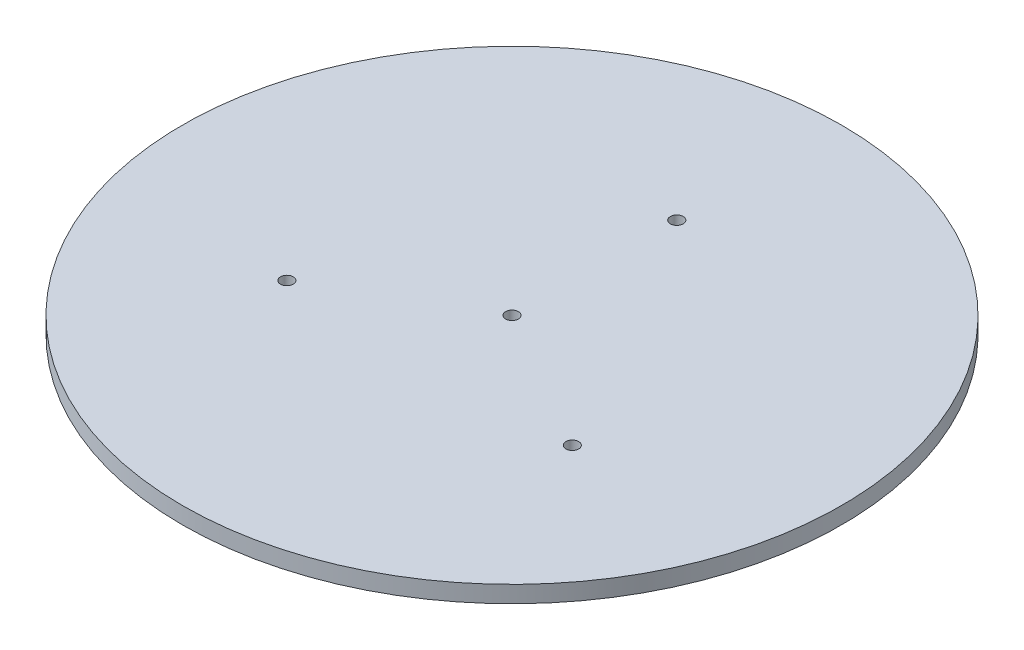
ISO-10303-21;
HEADER;
FILE_DESCRIPTION(('STEP AP214'),'2;1');
FILE_NAME('part.step','',(''),(''),'','','');
FILE_SCHEMA(('AUTOMOTIVE_DESIGN { 1 0 10303 214 1 1 1 1 }'));
ENDSEC;
DATA;
#1=APPLICATION_CONTEXT('core data for automotive mechanical design processes');
#2=APPLICATION_PROTOCOL_DEFINITION('international standard','automotive_design',2000,#1);
#3=PRODUCT_CONTEXT('',#1,'mechanical');
#4=PRODUCT('Part','Part','',(#3));
#5=PRODUCT_RELATED_PRODUCT_CATEGORY('part','',(#4));
#6=PRODUCT_DEFINITION_FORMATION('','',#4);
#7=PRODUCT_DEFINITION_CONTEXT('part definition',#1,'design');
#8=PRODUCT_DEFINITION('design','',#6,#7);
#9=PRODUCT_DEFINITION_SHAPE('','',#8);
#10=(LENGTH_UNIT() NAMED_UNIT(*) SI_UNIT(.MILLI.,.METRE.));
#11=(NAMED_UNIT(*) PLANE_ANGLE_UNIT() SI_UNIT($,.RADIAN.));
#12=(NAMED_UNIT(*) SI_UNIT($,.STERADIAN.) SOLID_ANGLE_UNIT());
#13=UNCERTAINTY_MEASURE_WITH_UNIT(LENGTH_MEASURE(1.E-05),#10,'distance_accuracy_value','');
#14=(GEOMETRIC_REPRESENTATION_CONTEXT(3) GLOBAL_UNCERTAINTY_ASSIGNED_CONTEXT((#13)) GLOBAL_UNIT_ASSIGNED_CONTEXT((#10,
#11,#12)) REPRESENTATION_CONTEXT('',''));
#15=CARTESIAN_POINT('',(0.,0.,0.));
#16=DIRECTION('',(0.,0.,1.));
#17=DIRECTION('',(1.,0.,0.));
#18=AXIS2_PLACEMENT_3D('',#15,#16,#17);
#19=CARTESIAN_POINT('',(0.,6.35,0.));
#20=DIRECTION('',(0.,1.,0.));
#21=DIRECTION('',(0.,0.,1.));
#22=AXIS2_PLACEMENT_3D('',#19,#20,#21);
#23=PLANE('',#22);
#24=CARTESIAN_POINT('',(53.961501643931,6.35,31.1546875));
#25=DIRECTION('',(0.,1.,0.));
#26=DIRECTION('',(0.,0.,1.));
#27=AXIS2_PLACEMENT_3D('',#24,#25,#26);
#28=CIRCLE('',#27,2.4257);
#29=CARTESIAN_POINT('',(53.961501643931,6.35,33.5803875));
#30=VERTEX_POINT('',#29);
#31=EDGE_CURVE('E53',#30,#30,#28,.T.);
#32=ORIENTED_EDGE('',*,*,#31,.F.);
#33=EDGE_LOOP('',(#32));
#34=FACE_BOUND('',#33,.T.);
#35=CARTESIAN_POINT('',(0.,6.35,-62.309375));
#36=DIRECTION('',(0.,1.,0.));
#37=DIRECTION('',(0.,0.,1.));
#38=AXIS2_PLACEMENT_3D('',#35,#36,#37);
#39=CIRCLE('',#38,2.4257);
#40=CARTESIAN_POINT('',(0.,6.35,-59.883675));
#41=VERTEX_POINT('',#40);
#42=EDGE_CURVE('E42',#41,#41,#39,.T.);
#43=ORIENTED_EDGE('',*,*,#42,.F.);
#44=EDGE_LOOP('',(#43));
#45=FACE_BOUND('',#44,.T.);
#46=CARTESIAN_POINT('',(0.,6.35,0.));
#47=DIRECTION('',(0.,1.,0.));
#48=DIRECTION('',(0.,0.,1.));
#49=AXIS2_PLACEMENT_3D('',#46,#47,#48);
#50=CIRCLE('',#49,124.61875);
#51=CARTESIAN_POINT('',(0.,6.35,124.61875));
#52=VERTEX_POINT('',#51);
#53=EDGE_CURVE('E10',#52,#52,#50,.T.);
#54=ORIENTED_EDGE('',*,*,#53,.T.);
#55=EDGE_LOOP('',(#54));
#56=FACE_BOUND('',#55,.T.);
#57=CARTESIAN_POINT('',(0.,6.35,0.));
#58=DIRECTION('',(0.,1.,0.));
#59=DIRECTION('',(0.,0.,1.));
#60=AXIS2_PLACEMENT_3D('',#57,#58,#59);
#61=CIRCLE('',#60,2.4257);
#62=CARTESIAN_POINT('',(0.,6.35,2.4257));
#63=VERTEX_POINT('',#62);
#64=EDGE_CURVE('E47',#63,#63,#61,.T.);
#65=ORIENTED_EDGE('',*,*,#64,.F.);
#66=EDGE_LOOP('',(#65));
#67=FACE_BOUND('',#66,.T.);
#68=CARTESIAN_POINT('',(-53.961501643931,6.35,31.1546875));
#69=DIRECTION('',(0.,1.,0.));
#70=DIRECTION('',(0.,0.,1.));
#71=AXIS2_PLACEMENT_3D('',#68,#69,#70);
#72=CIRCLE('',#71,2.4257);
#73=CARTESIAN_POINT('',(-53.961501643931,6.35,33.5803875));
#74=VERTEX_POINT('',#73);
#75=EDGE_CURVE('E59',#74,#74,#72,.T.);
#76=ORIENTED_EDGE('',*,*,#75,.F.);
#77=EDGE_LOOP('',(#76));
#78=FACE_BOUND('',#77,.T.);
#79=ADVANCED_FACE('F31',(#34,#45,#56,#67,#78),#23,.T.);
#80=CARTESIAN_POINT('',(0.,0.,0.));
#81=DIRECTION('',(0.,1.,0.));
#82=DIRECTION('',(0.,0.,1.));
#83=AXIS2_PLACEMENT_3D('',#80,#81,#82);
#84=PLANE('',#83);
#85=CARTESIAN_POINT('',(53.961501643931,0.,31.1546875));
#86=DIRECTION('',(0.,1.,0.));
#87=DIRECTION('',(0.,0.,1.));
#88=AXIS2_PLACEMENT_3D('',#85,#86,#87);
#89=CIRCLE('',#88,2.4257);
#90=CARTESIAN_POINT('',(53.961501643931,0.,33.5803875));
#91=VERTEX_POINT('',#90);
#92=EDGE_CURVE('E56',#91,#91,#89,.T.);
#93=ORIENTED_EDGE('',*,*,#92,.T.);
#94=EDGE_LOOP('',(#93));
#95=FACE_BOUND('',#94,.T.);
#96=CARTESIAN_POINT('',(0.,0.,-62.309375));
#97=DIRECTION('',(0.,1.,0.));
#98=DIRECTION('',(0.,0.,1.));
#99=AXIS2_PLACEMENT_3D('',#96,#97,#98);
#100=CIRCLE('',#99,2.4257);
#101=CARTESIAN_POINT('',(0.,0.,-59.883675));
#102=VERTEX_POINT('',#101);
#103=EDGE_CURVE('E44',#102,#102,#100,.T.);
#104=ORIENTED_EDGE('',*,*,#103,.T.);
#105=EDGE_LOOP('',(#104));
#106=FACE_BOUND('',#105,.T.);
#107=CARTESIAN_POINT('',(0.,0.,0.));
#108=DIRECTION('',(0.,1.,0.));
#109=DIRECTION('',(0.,0.,1.));
#110=AXIS2_PLACEMENT_3D('',#107,#108,#109);
#111=CIRCLE('',#110,124.61875);
#112=CARTESIAN_POINT('',(0.,0.,124.61875));
#113=VERTEX_POINT('',#112);
#114=EDGE_CURVE('E35',#113,#113,#111,.T.);
#115=ORIENTED_EDGE('',*,*,#114,.F.);
#116=EDGE_LOOP('',(#115));
#117=FACE_BOUND('',#116,.T.);
#118=CARTESIAN_POINT('',(0.,0.,0.));
#119=DIRECTION('',(0.,1.,0.));
#120=DIRECTION('',(0.,0.,1.));
#121=AXIS2_PLACEMENT_3D('',#118,#119,#120);
#122=CIRCLE('',#121,2.4257);
#123=CARTESIAN_POINT('',(0.,0.,2.4257));
#124=VERTEX_POINT('',#123);
#125=EDGE_CURVE('E50',#124,#124,#122,.T.);
#126=ORIENTED_EDGE('',*,*,#125,.T.);
#127=EDGE_LOOP('',(#126));
#128=FACE_BOUND('',#127,.T.);
#129=CARTESIAN_POINT('',(-53.961501643931,0.,31.1546875));
#130=DIRECTION('',(0.,1.,0.));
#131=DIRECTION('',(0.,0.,1.));
#132=AXIS2_PLACEMENT_3D('',#129,#130,#131);
#133=CIRCLE('',#132,2.4257);
#134=CARTESIAN_POINT('',(-53.961501643931,0.,33.5803875));
#135=VERTEX_POINT('',#134);
#136=EDGE_CURVE('E62',#135,#135,#133,.T.);
#137=ORIENTED_EDGE('',*,*,#136,.T.);
#138=EDGE_LOOP('',(#137));
#139=FACE_BOUND('',#138,.T.);
#140=ADVANCED_FACE('F72',(#95,#106,#117,#128,#139),#84,.F.);
#141=CARTESIAN_POINT('',(0.,6.35,0.));
#142=DIRECTION('',(0.,-1.,0.));
#143=DIRECTION('',(0.,0.,-1.));
#144=AXIS2_PLACEMENT_3D('',#141,#142,#143);
#145=CYLINDRICAL_SURFACE('',#144,124.61875);
#146=ORIENTED_EDGE('',*,*,#53,.F.);
#147=EDGE_LOOP('',(#146));
#148=FACE_BOUND('',#147,.T.);
#149=ORIENTED_EDGE('',*,*,#114,.T.);
#150=EDGE_LOOP('',(#149));
#151=FACE_BOUND('',#150,.T.);
#152=ADVANCED_FACE('F33',(#148,#151),#145,.T.);
#153=CARTESIAN_POINT('',(0.,6.35,-62.309375));
#154=DIRECTION('',(0.,-1.,0.));
#155=DIRECTION('',(0.,0.,-1.));
#156=AXIS2_PLACEMENT_3D('',#153,#154,#155);
#157=CYLINDRICAL_SURFACE('',#156,2.4257);
#158=ORIENTED_EDGE('',*,*,#42,.T.);
#159=EDGE_LOOP('',(#158));
#160=FACE_BOUND('',#159,.T.);
#161=ORIENTED_EDGE('',*,*,#103,.F.);
#162=EDGE_LOOP('',(#161));
#163=FACE_BOUND('',#162,.T.);
#164=ADVANCED_FACE('F82',(#160,#163),#157,.F.);
#165=CARTESIAN_POINT('',(0.,6.35,0.));
#166=DIRECTION('',(0.,-1.,0.));
#167=DIRECTION('',(0.,0.,-1.));
#168=AXIS2_PLACEMENT_3D('',#165,#166,#167);
#169=CYLINDRICAL_SURFACE('',#168,2.4257);
#170=ORIENTED_EDGE('',*,*,#64,.T.);
#171=EDGE_LOOP('',(#170));
#172=FACE_BOUND('',#171,.T.);
#173=ORIENTED_EDGE('',*,*,#125,.F.);
#174=EDGE_LOOP('',(#173));
#175=FACE_BOUND('',#174,.T.);
#176=ADVANCED_FACE('F85',(#172,#175),#169,.F.);
#177=CARTESIAN_POINT('',(53.961501643931,6.35,31.1546875));
#178=DIRECTION('',(0.,-1.,0.));
#179=DIRECTION('',(0.,0.,-1.));
#180=AXIS2_PLACEMENT_3D('',#177,#178,#179);
#181=CYLINDRICAL_SURFACE('',#180,2.4257);
#182=ORIENTED_EDGE('',*,*,#31,.T.);
#183=EDGE_LOOP('',(#182));
#184=FACE_BOUND('',#183,.T.);
#185=ORIENTED_EDGE('',*,*,#92,.F.);
#186=EDGE_LOOP('',(#185));
#187=FACE_BOUND('',#186,.T.);
#188=ADVANCED_FACE('F89',(#184,#187),#181,.F.);
#189=CARTESIAN_POINT('',(-53.961501643931,6.35,31.1546875));
#190=DIRECTION('',(0.,-1.,0.));
#191=DIRECTION('',(0.,0.,-1.));
#192=AXIS2_PLACEMENT_3D('',#189,#190,#191);
#193=CYLINDRICAL_SURFACE('',#192,2.4257);
#194=ORIENTED_EDGE('',*,*,#75,.T.);
#195=EDGE_LOOP('',(#194));
#196=FACE_BOUND('',#195,.T.);
#197=ORIENTED_EDGE('',*,*,#136,.F.);
#198=EDGE_LOOP('',(#197));
#199=FACE_BOUND('',#198,.T.);
#200=ADVANCED_FACE('F68',(#196,#199),#193,.F.);
#201=CLOSED_SHELL('',(#79,#140,#152,#164,#176,#188,#200));
#202=MANIFOLD_SOLID_BREP('B2',#201);
#203=ADVANCED_BREP_SHAPE_REPRESENTATION('',(#18,#202),#14);
#204=SHAPE_DEFINITION_REPRESENTATION(#9,#203);
ENDSEC;
END-ISO-10303-21;
